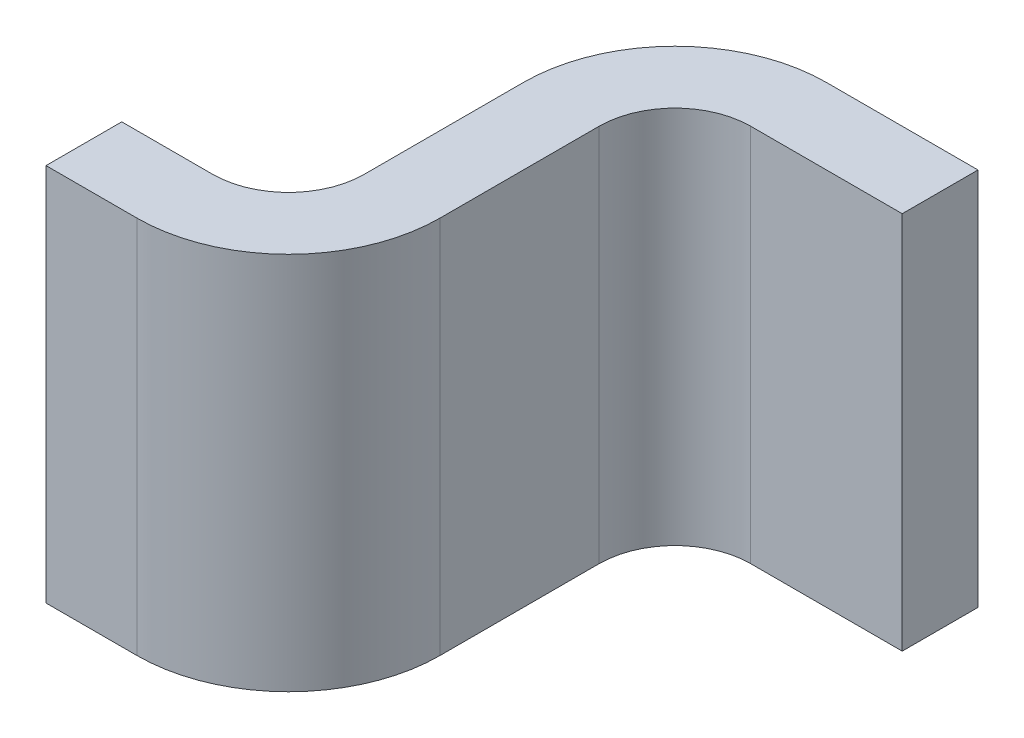
ISO-10303-21;
HEADER;
FILE_DESCRIPTION(('STEP AP214'),'2;1');
FILE_NAME('part.step','',(''),(''),'','','');
FILE_SCHEMA(('AUTOMOTIVE_DESIGN { 1 0 10303 214 1 1 1 1 }'));
ENDSEC;
DATA;
#1=APPLICATION_CONTEXT('core data for automotive mechanical design processes');
#2=APPLICATION_PROTOCOL_DEFINITION('international standard','automotive_design',2000,#1);
#3=PRODUCT_CONTEXT('',#1,'mechanical');
#4=PRODUCT('Part','Part','',(#3));
#5=PRODUCT_RELATED_PRODUCT_CATEGORY('part','',(#4));
#6=PRODUCT_DEFINITION_FORMATION('','',#4);
#7=PRODUCT_DEFINITION_CONTEXT('part definition',#1,'design');
#8=PRODUCT_DEFINITION('design','',#6,#7);
#9=PRODUCT_DEFINITION_SHAPE('','',#8);
#10=(LENGTH_UNIT() NAMED_UNIT(*) SI_UNIT(.MILLI.,.METRE.));
#11=(NAMED_UNIT(*) PLANE_ANGLE_UNIT() SI_UNIT($,.RADIAN.));
#12=(NAMED_UNIT(*) SI_UNIT($,.STERADIAN.) SOLID_ANGLE_UNIT());
#13=UNCERTAINTY_MEASURE_WITH_UNIT(LENGTH_MEASURE(1.E-05),#10,'distance_accuracy_value','');
#14=(GEOMETRIC_REPRESENTATION_CONTEXT(3) GLOBAL_UNCERTAINTY_ASSIGNED_CONTEXT((#13)) GLOBAL_UNIT_ASSIGNED_CONTEXT((#10,
#11,#12)) REPRESENTATION_CONTEXT('',''));
#15=CARTESIAN_POINT('',(0.,0.,0.));
#16=DIRECTION('',(0.,0.,1.));
#17=DIRECTION('',(1.,0.,0.));
#18=AXIS2_PLACEMENT_3D('',#15,#16,#17);
#19=CARTESIAN_POINT('',(0.,0.25,0.61));
#20=DIRECTION('',(0.,0.,-1.));
#21=DIRECTION('',(-1.,0.,0.));
#22=AXIS2_PLACEMENT_3D('',#19,#20,#21);
#23=PLANE('',#22);
#24=DIRECTION('',(1.,0.,0.));
#25=VECTOR('',#24,1.);
#26=CARTESIAN_POINT('',(0.,0.25,0.61));
#27=LINE('',#26,#25);
#28=CARTESIAN_POINT('',(0.12,0.25,0.61));
#29=VERTEX_POINT('',#28);
#30=CARTESIAN_POINT('',(0.,0.25,0.61));
#31=VERTEX_POINT('',#30);
#32=EDGE_CURVE('E191',#29,#31,#27,.F.);
#33=ORIENTED_EDGE('',*,*,#32,.T.);
#34=DIRECTION('',(0.,1.,0.));
#35=VECTOR('',#34,1.);
#36=CARTESIAN_POINT('',(0.,-0.25,0.61));
#37=LINE('',#36,#35);
#38=CARTESIAN_POINT('',(0.,-0.25,0.61));
#39=VERTEX_POINT('',#38);
#40=EDGE_CURVE('E93',#39,#31,#37,.T.);
#41=ORIENTED_EDGE('',*,*,#40,.F.);
#42=DIRECTION('',(1.,0.,0.));
#43=VECTOR('',#42,1.);
#44=CARTESIAN_POINT('',(0.,-0.25,0.61));
#45=LINE('',#44,#43);
#46=CARTESIAN_POINT('',(0.12,-0.25,0.61));
#47=VERTEX_POINT('',#46);
#48=EDGE_CURVE('E174',#39,#47,#45,.T.);
#49=ORIENTED_EDGE('',*,*,#48,.T.);
#50=DIRECTION('',(0.,1.,0.));
#51=VECTOR('',#50,1.);
#52=CARTESIAN_POINT('',(0.12,0.25,0.61));
#53=LINE('',#52,#51);
#54=EDGE_CURVE('E85',#29,#47,#53,.F.);
#55=ORIENTED_EDGE('',*,*,#54,.F.);
#56=EDGE_LOOP('',(#33,#41,#49,#55));
#57=FACE_BOUND('',#56,.T.);
#58=ADVANCED_FACE('F16',(#57),#23,.F.);
#59=CARTESIAN_POINT('',(0.,-0.25,0.51));
#60=DIRECTION('',(-1.,0.,0.));
#61=DIRECTION('',(0.,0.,1.));
#62=AXIS2_PLACEMENT_3D('',#59,#60,#61);
#63=PLANE('',#62);
#64=DIRECTION('',(0.,0.,1.));
#65=VECTOR('',#64,1.);
#66=CARTESIAN_POINT('',(0.,0.25,0.51));
#67=LINE('',#66,#65);
#68=CARTESIAN_POINT('',(0.,0.25,0.51));
#69=VERTEX_POINT('',#68);
#70=EDGE_CURVE('E181',#31,#69,#67,.F.);
#71=ORIENTED_EDGE('',*,*,#70,.T.);
#72=DIRECTION('',(0.,1.,0.));
#73=VECTOR('',#72,1.);
#74=CARTESIAN_POINT('',(0.,-0.25,0.51));
#75=LINE('',#74,#73);
#76=CARTESIAN_POINT('',(0.,-0.25,0.51));
#77=VERTEX_POINT('',#76);
#78=EDGE_CURVE('E164',#69,#77,#75,.F.);
#79=ORIENTED_EDGE('',*,*,#78,.T.);
#80=DIRECTION('',(0.,0.,1.));
#81=VECTOR('',#80,1.);
#82=CARTESIAN_POINT('',(0.,-0.25,0.61));
#83=LINE('',#82,#81);
#84=EDGE_CURVE('E176',#77,#39,#83,.T.);
#85=ORIENTED_EDGE('',*,*,#84,.T.);
#86=ORIENTED_EDGE('',*,*,#40,.T.);
#87=EDGE_LOOP('',(#71,#79,#85,#86));
#88=FACE_BOUND('',#87,.T.);
#89=ADVANCED_FACE('F226',(#88),#63,.T.);
#90=CARTESIAN_POINT('',(0.12,0.25,0.41));
#91=DIRECTION('',(0.,1.,0.));
#92=DIRECTION('',(0.,0.,1.));
#93=AXIS2_PLACEMENT_3D('',#90,#91,#92);
#94=CYLINDRICAL_SURFACE('',#93,0.2);
#95=CARTESIAN_POINT('',(0.12,0.25,0.41));
#96=DIRECTION('',(0.,1.,0.));
#97=DIRECTION('',(0.,0.,1.));
#98=AXIS2_PLACEMENT_3D('',#95,#96,#97);
#99=CIRCLE('',#98,0.2);
#100=CARTESIAN_POINT('',(0.32,0.25,0.41));
#101=VERTEX_POINT('',#100);
#102=EDGE_CURVE('E19',#29,#101,#99,.T.);
#103=ORIENTED_EDGE('',*,*,#102,.F.);
#104=ORIENTED_EDGE('',*,*,#54,.T.);
#105=CARTESIAN_POINT('',(0.12,-0.25,0.41));
#106=DIRECTION('',(0.,1.,0.));
#107=DIRECTION('',(0.,0.,1.));
#108=AXIS2_PLACEMENT_3D('',#105,#106,#107);
#109=CIRCLE('',#108,0.2);
#110=CARTESIAN_POINT('',(0.32,-0.25,0.41));
#111=VERTEX_POINT('',#110);
#112=EDGE_CURVE('E157',#111,#47,#109,.F.);
#113=ORIENTED_EDGE('',*,*,#112,.F.);
#114=DIRECTION('',(0.,1.,0.));
#115=VECTOR('',#114,1.);
#116=CARTESIAN_POINT('',(0.32,0.25,0.41));
#117=LINE('',#116,#115);
#118=EDGE_CURVE('E152',#111,#101,#117,.T.);
#119=ORIENTED_EDGE('',*,*,#118,.T.);
#120=EDGE_LOOP('',(#103,#104,#113,#119));
#121=FACE_BOUND('',#120,.T.);
#122=ADVANCED_FACE('F214',(#121),#94,.T.);
#123=CARTESIAN_POINT('',(0.42,0.25,0.1));
#124=DIRECTION('',(0.,0.,-1.));
#125=DIRECTION('',(-1.,0.,0.));
#126=AXIS2_PLACEMENT_3D('',#123,#124,#125);
#127=PLANE('',#126);
#128=DIRECTION('',(1.,0.,0.));
#129=VECTOR('',#128,1.);
#130=CARTESIAN_POINT('',(0.42,0.25,0.1));
#131=LINE('',#130,#129);
#132=CARTESIAN_POINT('',(0.62,0.25,0.1));
#133=VERTEX_POINT('',#132);
#134=CARTESIAN_POINT('',(0.42,0.25,0.1));
#135=VERTEX_POINT('',#134);
#136=EDGE_CURVE('E150',#133,#135,#131,.F.);
#137=ORIENTED_EDGE('',*,*,#136,.T.);
#138=DIRECTION('',(0.,-1.,0.));
#139=VECTOR('',#138,1.);
#140=CARTESIAN_POINT('',(0.42,0.25,0.1));
#141=LINE('',#140,#139);
#142=CARTESIAN_POINT('',(0.42,-0.25,0.1));
#143=VERTEX_POINT('',#142);
#144=EDGE_CURVE('E149',#135,#143,#141,.T.);
#145=ORIENTED_EDGE('',*,*,#144,.T.);
#146=DIRECTION('',(1.,0.,0.));
#147=VECTOR('',#146,1.);
#148=CARTESIAN_POINT('',(0.42,-0.25,0.1));
#149=LINE('',#148,#147);
#150=CARTESIAN_POINT('',(0.62,-0.25,0.1));
#151=VERTEX_POINT('',#150);
#152=EDGE_CURVE('E120',#143,#151,#149,.T.);
#153=ORIENTED_EDGE('',*,*,#152,.T.);
#154=DIRECTION('',(0.,1.,0.));
#155=VECTOR('',#154,1.);
#156=CARTESIAN_POINT('',(0.62,-0.25,0.1));
#157=LINE('',#156,#155);
#158=EDGE_CURVE('E117',#151,#133,#157,.T.);
#159=ORIENTED_EDGE('',*,*,#158,.T.);
#160=EDGE_LOOP('',(#137,#145,#153,#159));
#161=FACE_BOUND('',#160,.T.);
#162=ADVANCED_FACE('F264',(#161),#127,.F.);
#163=CARTESIAN_POINT('',(0.,-0.25,0.51));
#164=DIRECTION('',(0.,0.,1.));
#165=DIRECTION('',(1.,0.,0.));
#166=AXIS2_PLACEMENT_3D('',#163,#164,#165);
#167=PLANE('',#166);
#168=DIRECTION('',(1.,0.,0.));
#169=VECTOR('',#168,1.);
#170=CARTESIAN_POINT('',(0.,-0.25,0.51));
#171=LINE('',#170,#169);
#172=CARTESIAN_POINT('',(0.12,-0.25,0.51));
#173=VERTEX_POINT('',#172);
#174=EDGE_CURVE('E162',#77,#173,#171,.T.);
#175=ORIENTED_EDGE('',*,*,#174,.F.);
#176=ORIENTED_EDGE('',*,*,#78,.F.);
#177=DIRECTION('',(1.,0.,0.));
#178=VECTOR('',#177,1.);
#179=CARTESIAN_POINT('',(0.,0.25,0.51));
#180=LINE('',#179,#178);
#181=CARTESIAN_POINT('',(0.12,0.25,0.51));
#182=VERTEX_POINT('',#181);
#183=EDGE_CURVE('E167',#182,#69,#180,.F.);
#184=ORIENTED_EDGE('',*,*,#183,.F.);
#185=DIRECTION('',(0.,1.,0.));
#186=VECTOR('',#185,1.);
#187=CARTESIAN_POINT('',(0.12,-0.25,0.51));
#188=LINE('',#187,#186);
#189=EDGE_CURVE('E158',#182,#173,#188,.F.);
#190=ORIENTED_EDGE('',*,*,#189,.T.);
#191=EDGE_LOOP('',(#175,#176,#184,#190));
#192=FACE_BOUND('',#191,.T.);
#193=ADVANCED_FACE('F261',(#192),#167,.F.);
#194=CARTESIAN_POINT('',(0.32,0.25,0.41));
#195=DIRECTION('',(-1.,0.,0.));
#196=DIRECTION('',(0.,0.,1.));
#197=AXIS2_PLACEMENT_3D('',#194,#195,#196);
#198=PLANE('',#197);
#199=DIRECTION('',(0.,0.,-1.));
#200=VECTOR('',#199,1.);
#201=CARTESIAN_POINT('',(0.32,0.25,0.41));
#202=LINE('',#201,#200);
#203=CARTESIAN_POINT('',(0.32,0.25,0.2));
#204=VERTEX_POINT('',#203);
#205=EDGE_CURVE('E145',#204,#101,#202,.F.);
#206=ORIENTED_EDGE('',*,*,#205,.T.);
#207=ORIENTED_EDGE('',*,*,#118,.F.);
#208=DIRECTION('',(0.,0.,1.));
#209=VECTOR('',#208,1.);
#210=CARTESIAN_POINT('',(0.32,-0.25,0.41));
#211=LINE('',#210,#209);
#212=CARTESIAN_POINT('',(0.32,-0.25,0.2));
#213=VERTEX_POINT('',#212);
#214=EDGE_CURVE('E206',#111,#213,#211,.F.);
#215=ORIENTED_EDGE('',*,*,#214,.T.);
#216=DIRECTION('',(0.,-1.,0.));
#217=VECTOR('',#216,1.);
#218=CARTESIAN_POINT('',(0.32,0.25,0.2));
#219=LINE('',#218,#217);
#220=EDGE_CURVE('E119',#213,#204,#219,.F.);
#221=ORIENTED_EDGE('',*,*,#220,.T.);
#222=EDGE_LOOP('',(#206,#207,#215,#221));
#223=FACE_BOUND('',#222,.T.);
#224=ADVANCED_FACE('F216',(#223),#198,.F.);
#225=CARTESIAN_POINT('',(0.62,-0.25,0.));
#226=DIRECTION('',(-1.,0.,0.));
#227=DIRECTION('',(0.,0.,1.));
#228=AXIS2_PLACEMENT_3D('',#225,#226,#227);
#229=PLANE('',#228);
#230=DIRECTION('',(0.,0.,1.));
#231=VECTOR('',#230,1.);
#232=CARTESIAN_POINT('',(0.62,0.25,0.));
#233=LINE('',#232,#231);
#234=CARTESIAN_POINT('',(0.62,0.25,0.));
#235=VERTEX_POINT('',#234);
#236=EDGE_CURVE('E141',#133,#235,#233,.F.);
#237=ORIENTED_EDGE('',*,*,#236,.F.);
#238=ORIENTED_EDGE('',*,*,#158,.F.);
#239=DIRECTION('',(0.,0.,1.));
#240=VECTOR('',#239,1.);
#241=CARTESIAN_POINT('',(0.62,-0.25,0.1));
#242=LINE('',#241,#240);
#243=CARTESIAN_POINT('',(0.62,-0.25,0.));
#244=VERTEX_POINT('',#243);
#245=EDGE_CURVE('E110',#151,#244,#242,.F.);
#246=ORIENTED_EDGE('',*,*,#245,.T.);
#247=DIRECTION('',(0.,1.,0.));
#248=VECTOR('',#247,1.);
#249=CARTESIAN_POINT('',(0.62,-0.25,0.));
#250=LINE('',#249,#248);
#251=EDGE_CURVE('E115',#244,#235,#250,.T.);
#252=ORIENTED_EDGE('',*,*,#251,.T.);
#253=EDGE_LOOP('',(#237,#238,#246,#252));
#254=FACE_BOUND('',#253,.T.);
#255=ADVANCED_FACE('F113',(#254),#229,.F.);
#256=CARTESIAN_POINT('',(0.42,0.25,0.2));
#257=DIRECTION('',(0.,-1.,0.));
#258=DIRECTION('',(0.,0.,-1.));
#259=AXIS2_PLACEMENT_3D('',#256,#257,#258);
#260=CYLINDRICAL_SURFACE('',#259,0.1);
#261=CARTESIAN_POINT('',(0.42,0.25,0.2));
#262=DIRECTION('',(0.,-1.,0.));
#263=DIRECTION('',(0.,0.,-1.));
#264=AXIS2_PLACEMENT_3D('',#261,#262,#263);
#265=CIRCLE('',#264,0.1);
#266=EDGE_CURVE('E203',#204,#135,#265,.T.);
#267=ORIENTED_EDGE('',*,*,#266,.F.);
#268=ORIENTED_EDGE('',*,*,#220,.F.);
#269=CARTESIAN_POINT('',(0.42,-0.25,0.2));
#270=DIRECTION('',(0.,-1.,0.));
#271=DIRECTION('',(0.,0.,-1.));
#272=AXIS2_PLACEMENT_3D('',#269,#270,#271);
#273=CIRCLE('',#272,0.1);
#274=EDGE_CURVE('E132',#143,#213,#273,.F.);
#275=ORIENTED_EDGE('',*,*,#274,.F.);
#276=ORIENTED_EDGE('',*,*,#144,.F.);
#277=EDGE_LOOP('',(#267,#268,#275,#276));
#278=FACE_BOUND('',#277,.T.);
#279=ADVANCED_FACE('F252',(#278),#260,.F.);
#280=CARTESIAN_POINT('',(0.12,-0.25,0.41));
#281=DIRECTION('',(0.,1.,0.));
#282=DIRECTION('',(0.,0.,1.));
#283=AXIS2_PLACEMENT_3D('',#280,#281,#282);
#284=CYLINDRICAL_SURFACE('',#283,0.1);
#285=CARTESIAN_POINT('',(0.12,-0.25,0.41));
#286=DIRECTION('',(0.,1.,0.));
#287=DIRECTION('',(0.,0.,1.));
#288=AXIS2_PLACEMENT_3D('',#285,#286,#287);
#289=CIRCLE('',#288,0.1);
#290=CARTESIAN_POINT('',(0.22,-0.25,0.41));
#291=VERTEX_POINT('',#290);
#292=EDGE_CURVE('E161',#173,#291,#289,.T.);
#293=ORIENTED_EDGE('',*,*,#292,.F.);
#294=ORIENTED_EDGE('',*,*,#189,.F.);
#295=CARTESIAN_POINT('',(0.12,0.25,0.41));
#296=DIRECTION('',(0.,1.,0.));
#297=DIRECTION('',(0.,0.,1.));
#298=AXIS2_PLACEMENT_3D('',#295,#296,#297);
#299=CIRCLE('',#298,0.1);
#300=CARTESIAN_POINT('',(0.22,0.25,0.41));
#301=VERTEX_POINT('',#300);
#302=EDGE_CURVE('E148',#301,#182,#299,.F.);
#303=ORIENTED_EDGE('',*,*,#302,.F.);
#304=DIRECTION('',(0.,1.,0.));
#305=VECTOR('',#304,1.);
#306=CARTESIAN_POINT('',(0.22,-0.25,0.41));
#307=LINE('',#306,#305);
#308=EDGE_CURVE('E367',#301,#291,#307,.F.);
#309=ORIENTED_EDGE('',*,*,#308,.T.);
#310=EDGE_LOOP('',(#293,#294,#303,#309));
#311=FACE_BOUND('',#310,.T.);
#312=ADVANCED_FACE('F249',(#311),#284,.F.);
#313=CARTESIAN_POINT('',(0.313933982822,0.25,0.09393398282202));
#314=DIRECTION('',(0.,1.,0.));
#315=DIRECTION('',(0.,0.,1.));
#316=AXIS2_PLACEMENT_3D('',#313,#314,#315);
#317=PLANE('',#316);
#318=CARTESIAN_POINT('',(0.42,0.25,0.2));
#319=DIRECTION('',(0.,-1.,0.));
#320=DIRECTION('',(0.,0.,-1.));
#321=AXIS2_PLACEMENT_3D('',#318,#319,#320);
#322=CIRCLE('',#321,0.2);
#323=CARTESIAN_POINT('',(0.22,0.25,0.2));
#324=VERTEX_POINT('',#323);
#325=CARTESIAN_POINT('',(0.42,0.25,0.));
#326=VERTEX_POINT('',#325);
#327=EDGE_CURVE('E200',#324,#326,#322,.T.);
#328=ORIENTED_EDGE('',*,*,#327,.F.);
#329=DIRECTION('',(0.,0.,-1.));
#330=VECTOR('',#329,1.);
#331=CARTESIAN_POINT('',(0.22,0.25,0.41));
#332=LINE('',#331,#330);
#333=EDGE_CURVE('E134',#324,#301,#332,.F.);
#334=ORIENTED_EDGE('',*,*,#333,.T.);
#335=ORIENTED_EDGE('',*,*,#302,.T.);
#336=ORIENTED_EDGE('',*,*,#183,.T.);
#337=ORIENTED_EDGE('',*,*,#70,.F.);
#338=ORIENTED_EDGE('',*,*,#32,.F.);
#339=ORIENTED_EDGE('',*,*,#102,.T.);
#340=ORIENTED_EDGE('',*,*,#205,.F.);
#341=ORIENTED_EDGE('',*,*,#266,.T.);
#342=ORIENTED_EDGE('',*,*,#136,.F.);
#343=ORIENTED_EDGE('',*,*,#236,.T.);
#344=DIRECTION('',(1.,0.,0.));
#345=VECTOR('',#344,1.);
#346=CARTESIAN_POINT('',(0.42,0.25,0.));
#347=LINE('',#346,#345);
#348=EDGE_CURVE('E129',#235,#326,#347,.F.);
#349=ORIENTED_EDGE('',*,*,#348,.T.);
#350=EDGE_LOOP('',(#328,#334,#335,#336,#337,#338,#339,#340,#341,#342,#343,#349));
#351=FACE_BOUND('',#350,.T.);
#352=ADVANCED_FACE('F223',(#351),#317,.T.);
#353=CARTESIAN_POINT('',(0.42,-0.25,0.));
#354=DIRECTION('',(0.,0.,1.));
#355=DIRECTION('',(1.,0.,0.));
#356=AXIS2_PLACEMENT_3D('',#353,#354,#355);
#357=PLANE('',#356);
#358=DIRECTION('',(1.,0.,0.));
#359=VECTOR('',#358,1.);
#360=CARTESIAN_POINT('',(0.42,-0.25,0.));
#361=LINE('',#360,#359);
#362=CARTESIAN_POINT('',(0.42,-0.25,0.));
#363=VERTEX_POINT('',#362);
#364=EDGE_CURVE('E122',#363,#244,#361,.T.);
#365=ORIENTED_EDGE('',*,*,#364,.F.);
#366=DIRECTION('',(0.,-1.,0.));
#367=VECTOR('',#366,1.);
#368=CARTESIAN_POINT('',(0.42,-0.25,0.));
#369=LINE('',#368,#367);
#370=EDGE_CURVE('E199',#326,#363,#369,.T.);
#371=ORIENTED_EDGE('',*,*,#370,.F.);
#372=ORIENTED_EDGE('',*,*,#348,.F.);
#373=ORIENTED_EDGE('',*,*,#251,.F.);
#374=EDGE_LOOP('',(#365,#371,#372,#373));
#375=FACE_BOUND('',#374,.T.);
#376=ADVANCED_FACE('F131',(#375),#357,.F.);
#377=CARTESIAN_POINT('',(0.313933982822,-0.25,0.09393398282202));
#378=DIRECTION('',(0.,-1.,0.));
#379=DIRECTION('',(0.,0.,-1.));
#380=AXIS2_PLACEMENT_3D('',#377,#378,#379);
#381=PLANE('',#380);
#382=ORIENTED_EDGE('',*,*,#274,.T.);
#383=ORIENTED_EDGE('',*,*,#214,.F.);
#384=ORIENTED_EDGE('',*,*,#112,.T.);
#385=ORIENTED_EDGE('',*,*,#48,.F.);
#386=ORIENTED_EDGE('',*,*,#84,.F.);
#387=ORIENTED_EDGE('',*,*,#174,.T.);
#388=ORIENTED_EDGE('',*,*,#292,.T.);
#389=DIRECTION('',(0.,0.,-1.));
#390=VECTOR('',#389,1.);
#391=CARTESIAN_POINT('',(0.22,-0.25,0.41));
#392=LINE('',#391,#390);
#393=CARTESIAN_POINT('',(0.22,-0.25,0.2));
#394=VERTEX_POINT('',#393);
#395=EDGE_CURVE('E34',#291,#394,#392,.T.);
#396=ORIENTED_EDGE('',*,*,#395,.T.);
#397=CARTESIAN_POINT('',(0.42,-0.25,0.2));
#398=DIRECTION('',(0.,-1.,0.));
#399=DIRECTION('',(0.,0.,-1.));
#400=AXIS2_PLACEMENT_3D('',#397,#398,#399);
#401=CIRCLE('',#400,0.2);
#402=EDGE_CURVE('E25',#363,#394,#401,.F.);
#403=ORIENTED_EDGE('',*,*,#402,.F.);
#404=ORIENTED_EDGE('',*,*,#364,.T.);
#405=ORIENTED_EDGE('',*,*,#245,.F.);
#406=ORIENTED_EDGE('',*,*,#152,.F.);
#407=EDGE_LOOP('',(#382,#383,#384,#385,#386,#387,#388,#396,#403,#404,#405,#406));
#408=FACE_BOUND('',#407,.T.);
#409=ADVANCED_FACE('F124',(#408),#381,.T.);
#410=CARTESIAN_POINT('',(0.22,-0.25,0.41));
#411=DIRECTION('',(1.,0.,0.));
#412=DIRECTION('',(0.,0.,-1.));
#413=AXIS2_PLACEMENT_3D('',#410,#411,#412);
#414=PLANE('',#413);
#415=ORIENTED_EDGE('',*,*,#395,.F.);
#416=ORIENTED_EDGE('',*,*,#308,.F.);
#417=ORIENTED_EDGE('',*,*,#333,.F.);
#418=DIRECTION('',(0.,-1.,0.));
#419=VECTOR('',#418,1.);
#420=CARTESIAN_POINT('',(0.22,-0.25,0.2));
#421=LINE('',#420,#419);
#422=EDGE_CURVE('E11',#394,#324,#421,.F.);
#423=ORIENTED_EDGE('',*,*,#422,.F.);
#424=EDGE_LOOP('',(#415,#416,#417,#423));
#425=FACE_BOUND('',#424,.T.);
#426=ADVANCED_FACE('F234',(#425),#414,.F.);
#427=CARTESIAN_POINT('',(0.42,-0.25,0.2));
#428=DIRECTION('',(0.,-1.,0.));
#429=DIRECTION('',(0.,0.,-1.));
#430=AXIS2_PLACEMENT_3D('',#427,#428,#429);
#431=CYLINDRICAL_SURFACE('',#430,0.2);
#432=ORIENTED_EDGE('',*,*,#402,.T.);
#433=ORIENTED_EDGE('',*,*,#422,.T.);
#434=ORIENTED_EDGE('',*,*,#327,.T.);
#435=ORIENTED_EDGE('',*,*,#370,.T.);
#436=EDGE_LOOP('',(#432,#433,#434,#435));
#437=FACE_BOUND('',#436,.T.);
#438=ADVANCED_FACE('F232',(#437),#431,.T.);
#439=CLOSED_SHELL('',(#58,#89,#122,#162,#193,#224,#255,#279,#312,#352,#376,#409,#426,#438));
#440=MANIFOLD_SOLID_BREP('B1',#439);
#441=ADVANCED_BREP_SHAPE_REPRESENTATION('',(#18,#440),#14);
#442=SHAPE_DEFINITION_REPRESENTATION(#9,#441);
ENDSEC;
END-ISO-10303-21;
